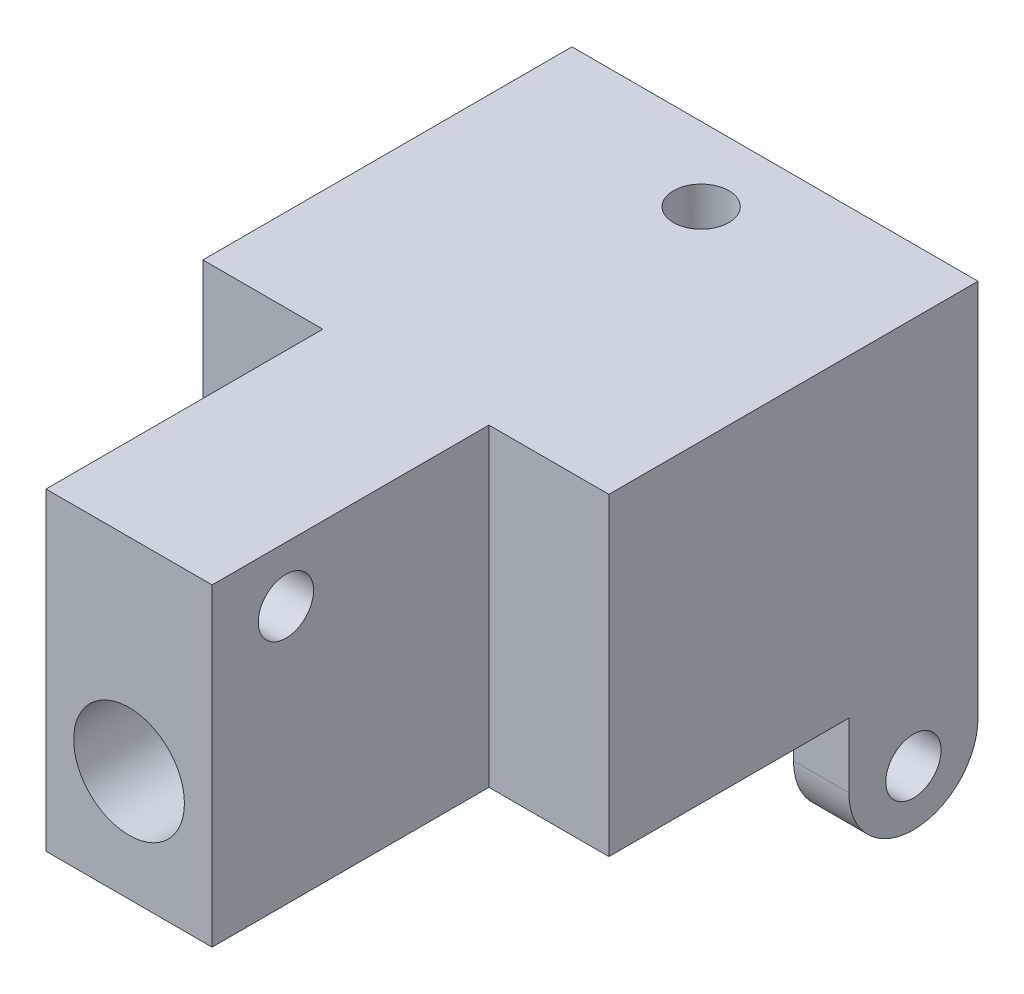
ISO-10303-21;
HEADER;
FILE_DESCRIPTION(('STEP AP214'),'2;1');
FILE_NAME('part.step','',(''),(''),'','','');
FILE_SCHEMA(('AUTOMOTIVE_DESIGN { 1 0 10303 214 1 1 1 1 }'));
ENDSEC;
DATA;
#1=APPLICATION_CONTEXT('core data for automotive mechanical design processes');
#2=APPLICATION_PROTOCOL_DEFINITION('international standard','automotive_design',2000,#1);
#3=PRODUCT_CONTEXT('',#1,'mechanical');
#4=PRODUCT('Part','Part','',(#3));
#5=PRODUCT_RELATED_PRODUCT_CATEGORY('part','',(#4));
#6=PRODUCT_DEFINITION_FORMATION('','',#4);
#7=PRODUCT_DEFINITION_CONTEXT('part definition',#1,'design');
#8=PRODUCT_DEFINITION('design','',#6,#7);
#9=PRODUCT_DEFINITION_SHAPE('','',#8);
#10=(LENGTH_UNIT() NAMED_UNIT(*) SI_UNIT(.MILLI.,.METRE.));
#11=(NAMED_UNIT(*) PLANE_ANGLE_UNIT() SI_UNIT($,.RADIAN.));
#12=(NAMED_UNIT(*) SI_UNIT($,.STERADIAN.) SOLID_ANGLE_UNIT());
#13=UNCERTAINTY_MEASURE_WITH_UNIT(LENGTH_MEASURE(1.E-05),#10,'distance_accuracy_value','');
#14=(GEOMETRIC_REPRESENTATION_CONTEXT(3) GLOBAL_UNCERTAINTY_ASSIGNED_CONTEXT((#13)) GLOBAL_UNIT_ASSIGNED_CONTEXT((#10,
#11,#12)) REPRESENTATION_CONTEXT('',''));
#15=CARTESIAN_POINT('',(0.,0.,0.));
#16=DIRECTION('',(0.,0.,1.));
#17=DIRECTION('',(1.,0.,0.));
#18=AXIS2_PLACEMENT_3D('',#15,#16,#17);
#19=CARTESIAN_POINT('',(0.,0.,20.));
#20=DIRECTION('',(0.,0.,-1.));
#21=DIRECTION('',(-1.,0.,0.));
#22=AXIS2_PLACEMENT_3D('',#19,#20,#21);
#23=PLANE('',#22);
#24=DIRECTION('',(0.,1.,0.));
#25=VECTOR('',#24,1.);
#26=CARTESIAN_POINT('',(4.5,0.,20.));
#27=LINE('',#26,#25);
#28=CARTESIAN_POINT('',(4.5,-6.,20.));
#29=VERTEX_POINT('',#28);
#30=CARTESIAN_POINT('',(4.5,11.,20.));
#31=VERTEX_POINT('',#30);
#32=EDGE_CURVE('E59',#29,#31,#27,.T.);
#33=ORIENTED_EDGE('',*,*,#32,.F.);
#34=DIRECTION('',(1.,0.,0.));
#35=VECTOR('',#34,1.);
#36=CARTESIAN_POINT('',(-11.,-6.,20.));
#37=LINE('',#36,#35);
#38=CARTESIAN_POINT('',(11.,-6.,20.));
#39=VERTEX_POINT('',#38);
#40=EDGE_CURVE('E191',#29,#39,#37,.T.);
#41=ORIENTED_EDGE('',*,*,#40,.T.);
#42=DIRECTION('',(0.,1.,0.));
#43=VECTOR('',#42,1.);
#44=CARTESIAN_POINT('',(11.,-6.,20.));
#45=LINE('',#44,#43);
#46=CARTESIAN_POINT('',(11.,11.,20.));
#47=VERTEX_POINT('',#46);
#48=EDGE_CURVE('E286',#39,#47,#45,.T.);
#49=ORIENTED_EDGE('',*,*,#48,.T.);
#50=DIRECTION('',(1.,0.,0.));
#51=VECTOR('',#50,1.);
#52=CARTESIAN_POINT('',(-11.,11.,20.));
#53=LINE('',#52,#51);
#54=EDGE_CURVE('E287',#31,#47,#53,.T.);
#55=ORIENTED_EDGE('',*,*,#54,.F.);
#56=EDGE_LOOP('',(#33,#41,#49,#55));
#57=FACE_BOUND('',#56,.T.);
#58=ADVANCED_FACE('F35',(#57),#23,.F.);
#59=CARTESIAN_POINT('',(0.,0.,7.));
#60=DIRECTION('',(0.,0.,-1.));
#61=DIRECTION('',(-1.,0.,0.));
#62=AXIS2_PLACEMENT_3D('',#59,#60,#61);
#63=PLANE('',#62);
#64=DIRECTION('',(1.,0.,0.));
#65=VECTOR('',#64,1.);
#66=CARTESIAN_POINT('',(0.,-6.,7.));
#67=LINE('',#66,#65);
#68=CARTESIAN_POINT('',(-11.,-6.,7.));
#69=VERTEX_POINT('',#68);
#70=CARTESIAN_POINT('',(-8.,-6.,7.));
#71=VERTEX_POINT('',#70);
#72=EDGE_CURVE('E11',#69,#71,#67,.T.);
#73=ORIENTED_EDGE('',*,*,#72,.F.);
#74=DIRECTION('',(0.,-1.,0.));
#75=VECTOR('',#74,1.);
#76=CARTESIAN_POINT('',(-11.,6.,7.));
#77=LINE('',#76,#75);
#78=CARTESIAN_POINT('',(-11.,-9.5,7.));
#79=VERTEX_POINT('',#78);
#80=EDGE_CURVE('E342',#69,#79,#77,.T.);
#81=ORIENTED_EDGE('',*,*,#80,.T.);
#82=DIRECTION('',(-1.,0.,0.));
#83=VECTOR('',#82,1.);
#84=CARTESIAN_POINT('',(15.9497474683058,-9.5,7.));
#85=LINE('',#84,#83);
#86=CARTESIAN_POINT('',(-8.,-9.5,7.));
#87=VERTEX_POINT('',#86);
#88=EDGE_CURVE('E359',#87,#79,#85,.T.);
#89=ORIENTED_EDGE('',*,*,#88,.F.);
#90=DIRECTION('',(0.,1.,0.));
#91=VECTOR('',#90,1.);
#92=CARTESIAN_POINT('',(-8.,-6.,7.));
#93=LINE('',#92,#91);
#94=EDGE_CURVE('E334',#87,#71,#93,.T.);
#95=ORIENTED_EDGE('',*,*,#94,.T.);
#96=EDGE_LOOP('',(#73,#81,#89,#95));
#97=FACE_BOUND('',#96,.T.);
#98=ADVANCED_FACE('F234',(#97),#63,.F.);
#99=CARTESIAN_POINT('',(8.,-6.,7.));
#100=VERTEX_POINT('',#99);
#101=CARTESIAN_POINT('',(11.,-6.,7.));
#102=VERTEX_POINT('',#101);
#103=EDGE_CURVE('E44',#100,#102,#67,.T.);
#104=ORIENTED_EDGE('',*,*,#103,.F.);
#105=DIRECTION('',(0.,-1.,0.));
#106=VECTOR('',#105,1.);
#107=CARTESIAN_POINT('',(8.,-6.,7.));
#108=LINE('',#107,#106);
#109=CARTESIAN_POINT('',(8.00000000000001,-9.5,7.));
#110=VERTEX_POINT('',#109);
#111=EDGE_CURVE('E336',#100,#110,#108,.T.);
#112=ORIENTED_EDGE('',*,*,#111,.T.);
#113=DIRECTION('',(-1.,0.,0.));
#114=VECTOR('',#113,1.);
#115=CARTESIAN_POINT('',(15.9497474683058,-9.5,7.));
#116=LINE('',#115,#114);
#117=CARTESIAN_POINT('',(11.,-9.5,7.));
#118=VERTEX_POINT('',#117);
#119=EDGE_CURVE('E326',#118,#110,#116,.T.);
#120=ORIENTED_EDGE('',*,*,#119,.F.);
#121=DIRECTION('',(0.,1.,0.));
#122=VECTOR('',#121,1.);
#123=CARTESIAN_POINT('',(11.,6.,7.));
#124=LINE('',#123,#122);
#125=EDGE_CURVE('E340',#118,#102,#124,.T.);
#126=ORIENTED_EDGE('',*,*,#125,.T.);
#127=EDGE_LOOP('',(#104,#112,#120,#126));
#128=FACE_BOUND('',#127,.T.);
#129=ADVANCED_FACE('F240',(#128),#63,.F.);
#130=CARTESIAN_POINT('',(-8.,-6.,7.));
#131=DIRECTION('',(-1.,0.,0.));
#132=DIRECTION('',(0.,0.,1.));
#133=AXIS2_PLACEMENT_3D('',#130,#131,#132);
#134=PLANE('',#133);
#135=CARTESIAN_POINT('',(-8.,-10.,3.5));
#136=DIRECTION('',(-1.,0.,0.));
#137=DIRECTION('',(0.,0.,1.));
#138=AXIS2_PLACEMENT_3D('',#135,#136,#137);
#139=CIRCLE('',#138,1.5);
#140=CARTESIAN_POINT('',(-8.,-10.,5.));
#141=VERTEX_POINT('',#140);
#142=EDGE_CURVE('E316',#141,#141,#139,.T.);
#143=ORIENTED_EDGE('',*,*,#142,.T.);
#144=EDGE_LOOP('',(#143));
#145=FACE_BOUND('',#144,.T.);
#146=CARTESIAN_POINT('',(-8.,-9.5,3.5));
#147=DIRECTION('',(-1.,0.,0.));
#148=DIRECTION('',(0.,0.,1.));
#149=AXIS2_PLACEMENT_3D('',#146,#147,#148);
#150=CIRCLE('',#149,3.5);
#151=CARTESIAN_POINT('',(-7.99999999999999,-9.5,0.));
#152=VERTEX_POINT('',#151);
#153=EDGE_CURVE('E331',#152,#87,#150,.T.);
#154=ORIENTED_EDGE('',*,*,#153,.F.);
#155=DIRECTION('',(0.,1.,0.));
#156=VECTOR('',#155,1.);
#157=CARTESIAN_POINT('',(-8.,-6.,0.));
#158=LINE('',#157,#156);
#159=CARTESIAN_POINT('',(-8.,-6.,0.));
#160=VERTEX_POINT('',#159);
#161=EDGE_CURVE('E333',#152,#160,#158,.T.);
#162=ORIENTED_EDGE('',*,*,#161,.T.);
#163=DIRECTION('',(0.,0.,-1.));
#164=VECTOR('',#163,1.);
#165=CARTESIAN_POINT('',(-8.,-6.,7.));
#166=LINE('',#165,#164);
#167=EDGE_CURVE('E356',#71,#160,#166,.T.);
#168=ORIENTED_EDGE('',*,*,#167,.F.);
#169=ORIENTED_EDGE('',*,*,#94,.F.);
#170=EDGE_LOOP('',(#154,#162,#168,#169));
#171=FACE_BOUND('',#170,.T.);
#172=ADVANCED_FACE('F37',(#145,#171),#134,.F.);
#173=CARTESIAN_POINT('',(8.,-6.,7.));
#174=DIRECTION('',(1.,0.,0.));
#175=DIRECTION('',(0.,0.,-1.));
#176=AXIS2_PLACEMENT_3D('',#173,#174,#175);
#177=PLANE('',#176);
#178=CARTESIAN_POINT('',(8.,-10.,3.5));
#179=DIRECTION('',(1.,0.,0.));
#180=DIRECTION('',(0.,0.,-1.));
#181=AXIS2_PLACEMENT_3D('',#178,#179,#180);
#182=CIRCLE('',#181,1.5);
#183=CARTESIAN_POINT('',(8.,-10.,2.));
#184=VERTEX_POINT('',#183);
#185=EDGE_CURVE('E313',#184,#184,#182,.T.);
#186=ORIENTED_EDGE('',*,*,#185,.T.);
#187=EDGE_LOOP('',(#186));
#188=FACE_BOUND('',#187,.T.);
#189=DIRECTION('',(0.,-1.,0.));
#190=VECTOR('',#189,1.);
#191=CARTESIAN_POINT('',(8.,-6.,0.));
#192=LINE('',#191,#190);
#193=CARTESIAN_POINT('',(8.,-6.,0.));
#194=VERTEX_POINT('',#193);
#195=CARTESIAN_POINT('',(8.00000000000001,-9.5,0.));
#196=VERTEX_POINT('',#195);
#197=EDGE_CURVE('E348',#194,#196,#192,.T.);
#198=ORIENTED_EDGE('',*,*,#197,.T.);
#199=CARTESIAN_POINT('',(8.,-9.5,3.5));
#200=DIRECTION('',(1.,0.,0.));
#201=DIRECTION('',(0.,0.,-1.));
#202=AXIS2_PLACEMENT_3D('',#199,#200,#201);
#203=CIRCLE('',#202,3.5);
#204=EDGE_CURVE('E325',#110,#196,#203,.T.);
#205=ORIENTED_EDGE('',*,*,#204,.F.);
#206=ORIENTED_EDGE('',*,*,#111,.F.);
#207=DIRECTION('',(0.,0.,-1.));
#208=VECTOR('',#207,1.);
#209=CARTESIAN_POINT('',(8.,-6.,7.));
#210=LINE('',#209,#208);
#211=EDGE_CURVE('E344',#100,#194,#210,.T.);
#212=ORIENTED_EDGE('',*,*,#211,.T.);
#213=EDGE_LOOP('',(#198,#205,#206,#212));
#214=FACE_BOUND('',#213,.T.);
#215=ADVANCED_FACE('F391',(#188,#214),#177,.F.);
#216=CARTESIAN_POINT('',(11.,6.,7.));
#217=DIRECTION('',(-1.,0.,0.));
#218=DIRECTION('',(0.,-1.,0.));
#219=AXIS2_PLACEMENT_3D('',#216,#217,#218);
#220=PLANE('',#219);
#221=DIRECTION('',(0.,0.,-1.));
#222=VECTOR('',#221,1.);
#223=CARTESIAN_POINT('',(11.,-6.,20.));
#224=LINE('',#223,#222);
#225=EDGE_CURVE('E301',#39,#102,#224,.T.);
#226=ORIENTED_EDGE('',*,*,#225,.T.);
#227=ORIENTED_EDGE('',*,*,#125,.F.);
#228=CARTESIAN_POINT('',(11.,-9.5,3.5));
#229=DIRECTION('',(-1.,0.,0.));
#230=DIRECTION('',(0.,-1.,0.));
#231=AXIS2_PLACEMENT_3D('',#228,#229,#230);
#232=CIRCLE('',#231,3.5);
#233=CARTESIAN_POINT('',(11.,-9.5,0.));
#234=VERTEX_POINT('',#233);
#235=EDGE_CURVE('E323',#118,#234,#232,.F.);
#236=ORIENTED_EDGE('',*,*,#235,.T.);
#237=DIRECTION('',(0.,1.,0.));
#238=VECTOR('',#237,1.);
#239=CARTESIAN_POINT('',(11.,6.,0.));
#240=LINE('',#239,#238);
#241=CARTESIAN_POINT('',(11.,11.,0.));
#242=VERTEX_POINT('',#241);
#243=EDGE_CURVE('E351',#234,#242,#240,.T.);
#244=ORIENTED_EDGE('',*,*,#243,.T.);
#245=DIRECTION('',(0.,0.,-1.));
#246=VECTOR('',#245,1.);
#247=CARTESIAN_POINT('',(11.,11.,20.));
#248=LINE('',#247,#246);
#249=EDGE_CURVE('E304',#47,#242,#248,.T.);
#250=ORIENTED_EDGE('',*,*,#249,.F.);
#251=ORIENTED_EDGE('',*,*,#48,.F.);
#252=EDGE_LOOP('',(#226,#227,#236,#244,#250,#251));
#253=FACE_BOUND('',#252,.T.);
#254=CARTESIAN_POINT('',(11.,-10.,3.5));
#255=DIRECTION('',(-1.,0.,0.));
#256=DIRECTION('',(0.,-1.,0.));
#257=AXIS2_PLACEMENT_3D('',#254,#255,#256);
#258=CIRCLE('',#257,1.5);
#259=CARTESIAN_POINT('',(11.,-11.5,3.5));
#260=VERTEX_POINT('',#259);
#261=EDGE_CURVE('E310',#260,#260,#258,.F.);
#262=ORIENTED_EDGE('',*,*,#261,.F.);
#263=EDGE_LOOP('',(#262));
#264=FACE_BOUND('',#263,.T.);
#265=ADVANCED_FACE('F371',(#253,#264),#220,.F.);
#266=CARTESIAN_POINT('',(-11.,6.,7.));
#267=DIRECTION('',(1.,0.,0.));
#268=DIRECTION('',(0.,1.,0.));
#269=AXIS2_PLACEMENT_3D('',#266,#267,#268);
#270=PLANE('',#269);
#271=DIRECTION('',(0.,-1.,0.));
#272=VECTOR('',#271,1.);
#273=CARTESIAN_POINT('',(-11.,6.,0.));
#274=LINE('',#273,#272);
#275=CARTESIAN_POINT('',(-11.,11.,0.));
#276=VERTEX_POINT('',#275);
#277=CARTESIAN_POINT('',(-11.,-9.5,0.));
#278=VERTEX_POINT('',#277);
#279=EDGE_CURVE('E337',#276,#278,#274,.T.);
#280=ORIENTED_EDGE('',*,*,#279,.T.);
#281=CARTESIAN_POINT('',(-11.,-9.5,3.5));
#282=DIRECTION('',(-1.,0.,0.));
#283=DIRECTION('',(0.,-1.,0.));
#284=AXIS2_PLACEMENT_3D('',#281,#282,#283);
#285=CIRCLE('',#284,3.5);
#286=EDGE_CURVE('E322',#278,#79,#285,.T.);
#287=ORIENTED_EDGE('',*,*,#286,.T.);
#288=ORIENTED_EDGE('',*,*,#80,.F.);
#289=DIRECTION('',(0.,0.,-1.));
#290=VECTOR('',#289,1.);
#291=CARTESIAN_POINT('',(-11.,-6.,20.));
#292=LINE('',#291,#290);
#293=CARTESIAN_POINT('',(-11.,-6.,20.));
#294=VERTEX_POINT('',#293);
#295=EDGE_CURVE('E298',#294,#69,#292,.T.);
#296=ORIENTED_EDGE('',*,*,#295,.F.);
#297=DIRECTION('',(0.,1.,0.));
#298=VECTOR('',#297,1.);
#299=CARTESIAN_POINT('',(-11.,-6.,20.));
#300=LINE('',#299,#298);
#301=CARTESIAN_POINT('',(-11.,11.,20.));
#302=VERTEX_POINT('',#301);
#303=EDGE_CURVE('E260',#294,#302,#300,.T.);
#304=ORIENTED_EDGE('',*,*,#303,.T.);
#305=DIRECTION('',(0.,0.,-1.));
#306=VECTOR('',#305,1.);
#307=CARTESIAN_POINT('',(-11.,11.,20.));
#308=LINE('',#307,#306);
#309=EDGE_CURVE('E262',#302,#276,#308,.T.);
#310=ORIENTED_EDGE('',*,*,#309,.T.);
#311=EDGE_LOOP('',(#280,#287,#288,#296,#304,#310));
#312=FACE_BOUND('',#311,.T.);
#313=CARTESIAN_POINT('',(-11.,-10.,3.5));
#314=DIRECTION('',(-1.,0.,0.));
#315=DIRECTION('',(0.,-1.,0.));
#316=AXIS2_PLACEMENT_3D('',#313,#314,#315);
#317=CIRCLE('',#316,1.5);
#318=CARTESIAN_POINT('',(-11.,-11.5,3.5));
#319=VERTEX_POINT('',#318);
#320=EDGE_CURVE('E300',#319,#319,#317,.T.);
#321=ORIENTED_EDGE('',*,*,#320,.F.);
#322=EDGE_LOOP('',(#321));
#323=FACE_BOUND('',#322,.T.);
#324=ADVANCED_FACE('F382',(#312,#323),#270,.F.);
#325=CARTESIAN_POINT('',(0.,0.,0.));
#326=DIRECTION('',(0.,0.,-1.));
#327=DIRECTION('',(-1.,0.,0.));
#328=AXIS2_PLACEMENT_3D('',#325,#326,#327);
#329=PLANE('',#328);
#330=DIRECTION('',(1.,0.,0.));
#331=VECTOR('',#330,1.);
#332=CARTESIAN_POINT('',(-2.65,6.5,0.));
#333=LINE('',#332,#331);
#334=CARTESIAN_POINT('',(-2.65,6.5,0.));
#335=VERTEX_POINT('',#334);
#336=CARTESIAN_POINT('',(2.65,6.5,0.));
#337=VERTEX_POINT('',#336);
#338=EDGE_CURVE('E678',#335,#337,#333,.T.);
#339=ORIENTED_EDGE('',*,*,#338,.F.);
#340=DIRECTION('',(0.,-1.,0.));
#341=VECTOR('',#340,1.);
#342=CARTESIAN_POINT('',(-2.65,6.5,0.));
#343=LINE('',#342,#341);
#344=CARTESIAN_POINT('',(-2.65,4.,0.));
#345=VERTEX_POINT('',#344);
#346=EDGE_CURVE('E675',#335,#345,#343,.T.);
#347=ORIENTED_EDGE('',*,*,#346,.T.);
#348=DIRECTION('',(1.,0.,0.));
#349=VECTOR('',#348,1.);
#350=CARTESIAN_POINT('',(-2.65,4.,0.));
#351=LINE('',#350,#349);
#352=CARTESIAN_POINT('',(2.65,4.,0.));
#353=VERTEX_POINT('',#352);
#354=EDGE_CURVE('E664',#345,#353,#351,.T.);
#355=ORIENTED_EDGE('',*,*,#354,.T.);
#356=DIRECTION('',(0.,-1.,0.));
#357=VECTOR('',#356,1.);
#358=CARTESIAN_POINT('',(2.65,6.5,0.));
#359=LINE('',#358,#357);
#360=EDGE_CURVE('E680',#337,#353,#359,.T.);
#361=ORIENTED_EDGE('',*,*,#360,.F.);
#362=EDGE_LOOP('',(#339,#347,#355,#361));
#363=FACE_BOUND('',#362,.T.);
#364=CARTESIAN_POINT('',(0.,0.,0.));
#365=DIRECTION('',(0.,0.,-1.));
#366=DIRECTION('',(-1.,0.,0.));
#367=AXIS2_PLACEMENT_3D('',#364,#365,#366);
#368=CIRCLE('',#367,3.);
#369=CARTESIAN_POINT('',(-3.,0.,0.));
#370=VERTEX_POINT('',#369);
#371=EDGE_CURVE('E297',#370,#370,#368,.F.);
#372=ORIENTED_EDGE('',*,*,#371,.T.);
#373=EDGE_LOOP('',(#372));
#374=FACE_BOUND('',#373,.T.);
#375=DIRECTION('',(1.,0.,0.));
#376=VECTOR('',#375,1.);
#377=CARTESIAN_POINT('',(8.,-6.,0.));
#378=LINE('',#377,#376);
#379=EDGE_CURVE('E346',#160,#194,#378,.T.);
#380=ORIENTED_EDGE('',*,*,#379,.F.);
#381=ORIENTED_EDGE('',*,*,#161,.F.);
#382=DIRECTION('',(-1.,0.,0.));
#383=VECTOR('',#382,1.);
#384=CARTESIAN_POINT('',(15.9497474683058,-9.5,0.));
#385=LINE('',#384,#383);
#386=EDGE_CURVE('E362',#152,#278,#385,.T.);
#387=ORIENTED_EDGE('',*,*,#386,.T.);
#388=ORIENTED_EDGE('',*,*,#279,.F.);
#389=DIRECTION('',(1.,0.,0.));
#390=VECTOR('',#389,1.);
#391=CARTESIAN_POINT('',(-11.,11.,0.));
#392=LINE('',#391,#390);
#393=EDGE_CURVE('E294',#276,#242,#392,.T.);
#394=ORIENTED_EDGE('',*,*,#393,.T.);
#395=ORIENTED_EDGE('',*,*,#243,.F.);
#396=DIRECTION('',(-1.,0.,0.));
#397=VECTOR('',#396,1.);
#398=CARTESIAN_POINT('',(15.9497474683058,-9.5,0.));
#399=LINE('',#398,#397);
#400=EDGE_CURVE('E319',#234,#196,#399,.T.);
#401=ORIENTED_EDGE('',*,*,#400,.T.);
#402=ORIENTED_EDGE('',*,*,#197,.F.);
#403=EDGE_LOOP('',(#380,#381,#387,#388,#394,#395,#401,#402));
#404=FACE_BOUND('',#403,.T.);
#405=ADVANCED_FACE('F377',(#363,#374,#404),#329,.T.);
#406=CARTESIAN_POINT('',(8.,-6.,7.));
#407=DIRECTION('',(0.,1.,0.));
#408=DIRECTION('',(-1.,0.,0.));
#409=AXIS2_PLACEMENT_3D('',#406,#407,#408);
#410=PLANE('',#409);
#411=ORIENTED_EDGE('',*,*,#379,.T.);
#412=ORIENTED_EDGE('',*,*,#211,.F.);
#413=ORIENTED_EDGE('',*,*,#103,.T.);
#414=ORIENTED_EDGE('',*,*,#225,.F.);
#415=ORIENTED_EDGE('',*,*,#40,.F.);
#416=DIRECTION('',(0.,0.,-1.));
#417=VECTOR('',#416,1.);
#418=CARTESIAN_POINT('',(4.5,-6.,35.));
#419=LINE('',#418,#417);
#420=CARTESIAN_POINT('',(4.5,-6.,35.));
#421=VERTEX_POINT('',#420);
#422=EDGE_CURVE('E172',#421,#29,#419,.T.);
#423=ORIENTED_EDGE('',*,*,#422,.F.);
#424=DIRECTION('',(1.,0.,0.));
#425=VECTOR('',#424,1.);
#426=CARTESIAN_POINT('',(0.,-6.,35.));
#427=LINE('',#426,#425);
#428=CARTESIAN_POINT('',(-4.5,-6.,35.));
#429=VERTEX_POINT('',#428);
#430=EDGE_CURVE('E178',#429,#421,#427,.T.);
#431=ORIENTED_EDGE('',*,*,#430,.F.);
#432=DIRECTION('',(0.,0.,-1.));
#433=VECTOR('',#432,1.);
#434=CARTESIAN_POINT('',(-4.5,-6.,35.));
#435=LINE('',#434,#433);
#436=CARTESIAN_POINT('',(-4.5,-6.,20.));
#437=VERTEX_POINT('',#436);
#438=EDGE_CURVE('E264',#429,#437,#435,.T.);
#439=ORIENTED_EDGE('',*,*,#438,.T.);
#440=EDGE_CURVE('E258',#294,#437,#37,.T.);
#441=ORIENTED_EDGE('',*,*,#440,.F.);
#442=ORIENTED_EDGE('',*,*,#295,.T.);
#443=ORIENTED_EDGE('',*,*,#72,.T.);
#444=ORIENTED_EDGE('',*,*,#167,.T.);
#445=EDGE_LOOP('',(#411,#412,#413,#414,#415,#423,#431,#439,#441,#442,#443,#444));
#446=FACE_BOUND('',#445,.T.);
#447=ADVANCED_FACE('F189',(#446),#410,.F.);
#448=CARTESIAN_POINT('',(15.9497474683058,-9.5,3.5));
#449=DIRECTION('',(-1.,0.,0.));
#450=DIRECTION('',(0.,-1.,0.));
#451=AXIS2_PLACEMENT_3D('',#448,#449,#450);
#452=CYLINDRICAL_SURFACE('',#451,3.5);
#453=ORIENTED_EDGE('',*,*,#153,.T.);
#454=ORIENTED_EDGE('',*,*,#88,.T.);
#455=ORIENTED_EDGE('',*,*,#286,.F.);
#456=ORIENTED_EDGE('',*,*,#386,.F.);
#457=EDGE_LOOP('',(#453,#454,#455,#456));
#458=FACE_BOUND('',#457,.T.);
#459=ADVANCED_FACE('F399',(#458),#452,.T.);
#460=ORIENTED_EDGE('',*,*,#204,.T.);
#461=ORIENTED_EDGE('',*,*,#400,.F.);
#462=ORIENTED_EDGE('',*,*,#235,.F.);
#463=ORIENTED_EDGE('',*,*,#119,.T.);
#464=EDGE_LOOP('',(#460,#461,#462,#463));
#465=FACE_BOUND('',#464,.T.);
#466=ADVANCED_FACE('F395',(#465),#452,.T.);
#467=CARTESIAN_POINT('',(15.2426406871193,-10.,3.5));
#468=DIRECTION('',(-1.,0.,0.));
#469=DIRECTION('',(0.,-1.,0.));
#470=AXIS2_PLACEMENT_3D('',#467,#468,#469);
#471=CYLINDRICAL_SURFACE('',#470,1.5);
#472=ORIENTED_EDGE('',*,*,#320,.T.);
#473=EDGE_LOOP('',(#472));
#474=FACE_BOUND('',#473,.T.);
#475=ORIENTED_EDGE('',*,*,#142,.F.);
#476=EDGE_LOOP('',(#475));
#477=FACE_BOUND('',#476,.T.);
#478=ADVANCED_FACE('F398',(#474,#477),#471,.F.);
#479=ORIENTED_EDGE('',*,*,#261,.T.);
#480=EDGE_LOOP('',(#479));
#481=FACE_BOUND('',#480,.T.);
#482=ORIENTED_EDGE('',*,*,#185,.F.);
#483=EDGE_LOOP('',(#482));
#484=FACE_BOUND('',#483,.T.);
#485=ADVANCED_FACE('F254',(#481,#484),#471,.F.);
#486=CARTESIAN_POINT('',(-11.,11.,20.));
#487=DIRECTION('',(0.,1.,0.));
#488=DIRECTION('',(-1.,0.,0.));
#489=AXIS2_PLACEMENT_3D('',#486,#487,#488);
#490=PLANE('',#489);
#491=CARTESIAN_POINT('',(0.,11.,4.));
#492=DIRECTION('',(0.,1.,0.));
#493=DIRECTION('',(-1.,0.,0.));
#494=AXIS2_PLACEMENT_3D('',#491,#492,#493);
#495=CIRCLE('',#494,1.5);
#496=CARTESIAN_POINT('',(-1.5,11.,4.));
#497=VERTEX_POINT('',#496);
#498=EDGE_CURVE('E192',#497,#497,#495,.T.);
#499=ORIENTED_EDGE('',*,*,#498,.F.);
#500=EDGE_LOOP('',(#499));
#501=FACE_BOUND('',#500,.T.);
#502=ORIENTED_EDGE('',*,*,#393,.F.);
#503=ORIENTED_EDGE('',*,*,#309,.F.);
#504=CARTESIAN_POINT('',(-4.5,11.,20.));
#505=VERTEX_POINT('',#504);
#506=EDGE_CURVE('E284',#302,#505,#53,.T.);
#507=ORIENTED_EDGE('',*,*,#506,.T.);
#508=DIRECTION('',(0.,0.,-1.));
#509=VECTOR('',#508,1.);
#510=CARTESIAN_POINT('',(-4.5,11.,35.));
#511=LINE('',#510,#509);
#512=CARTESIAN_POINT('',(-4.5,11.,35.));
#513=VERTEX_POINT('',#512);
#514=EDGE_CURVE('E197',#513,#505,#511,.T.);
#515=ORIENTED_EDGE('',*,*,#514,.F.);
#516=DIRECTION('',(-1.,0.,0.));
#517=VECTOR('',#516,1.);
#518=CARTESIAN_POINT('',(0.,11.,35.));
#519=LINE('',#518,#517);
#520=CARTESIAN_POINT('',(4.5,11.,35.));
#521=VERTEX_POINT('',#520);
#522=EDGE_CURVE('E177',#521,#513,#519,.T.);
#523=ORIENTED_EDGE('',*,*,#522,.F.);
#524=DIRECTION('',(0.,0.,-1.));
#525=VECTOR('',#524,1.);
#526=CARTESIAN_POINT('',(4.5,11.,35.));
#527=LINE('',#526,#525);
#528=EDGE_CURVE('E174',#521,#31,#527,.T.);
#529=ORIENTED_EDGE('',*,*,#528,.T.);
#530=ORIENTED_EDGE('',*,*,#54,.T.);
#531=ORIENTED_EDGE('',*,*,#249,.T.);
#532=EDGE_LOOP('',(#502,#503,#507,#515,#523,#529,#530,#531));
#533=FACE_BOUND('',#532,.T.);
#534=ADVANCED_FACE('F247',(#501,#533),#490,.T.);
#535=ORIENTED_EDGE('',*,*,#440,.T.);
#536=DIRECTION('',(0.,1.,0.));
#537=VECTOR('',#536,1.);
#538=CARTESIAN_POINT('',(-4.5,0.,20.));
#539=LINE('',#538,#537);
#540=EDGE_CURVE('E51',#437,#505,#539,.T.);
#541=ORIENTED_EDGE('',*,*,#540,.T.);
#542=ORIENTED_EDGE('',*,*,#506,.F.);
#543=ORIENTED_EDGE('',*,*,#303,.F.);
#544=EDGE_LOOP('',(#535,#541,#542,#543));
#545=FACE_BOUND('',#544,.T.);
#546=ADVANCED_FACE('F236',(#545),#23,.F.);
#547=CARTESIAN_POINT('',(0.,0.,-8.48528137423857));
#548=DIRECTION('',(0.,0.,1.));
#549=DIRECTION('',(1.,0.,0.));
#550=AXIS2_PLACEMENT_3D('',#547,#548,#549);
#551=CYLINDRICAL_SURFACE('',#550,3.);
#552=CARTESIAN_POINT('',(0.,3.,5.5));
#553=CARTESIAN_POINT('',(-0.0788579444268502,2.99999570107562,5.49999504652421));
#554=CARTESIAN_POINT('',(-0.157809899546344,2.99685736529635,5.49374489031842));
#555=CARTESIAN_POINT('',(-0.313380352903344,2.98461234055736,5.46902067948769));
#556=CARTESIAN_POINT('',(-0.389994130070444,2.97549431743379,5.45052341050328));
#557=CARTESIAN_POINT('',(-0.538400317320673,2.95224419105063,5.40220928707506));
#558=CARTESIAN_POINT('',(-0.61021020440872,2.93813158766306,5.37243642362805));
#559=CARTESIAN_POINT('',(-0.747708925209898,2.90618664773642,5.30264406795252));
#560=CARTESIAN_POINT('',(-0.813398240985089,2.88835460450288,5.2626253836267));
#561=CARTESIAN_POINT('',(-0.941261726642864,2.84934387387093,5.17072412577207));
#562=CARTESIAN_POINT('',(-1.00298281668316,2.82802798691306,5.11827028114054));
#563=CARTESIAN_POINT('',(-1.11716916730047,2.78489955370115,5.00421778112945));
#564=CARTESIAN_POINT('',(-1.16962737466015,2.76308664313552,4.94261222234134));
#565=CARTESIAN_POINT('',(-1.26787800067542,2.71948426796021,4.80627497571493));
#566=CARTESIAN_POINT('',(-1.31283800332745,2.69782780455198,4.73089585248113));
#567=CARTESIAN_POINT('',(-1.38925234033604,2.65928968158481,4.57244899602068));
#568=CARTESIAN_POINT('',(-1.4207163224495,2.64240461410484,4.48938680691588));
#569=CARTESIAN_POINT('',(-1.46719866328288,2.61686800556713,4.32300234186712));
#570=CARTESIAN_POINT('',(-1.48308878562066,2.6077840737557,4.23999332189891));
#571=CARTESIAN_POINT('',(-1.50064048996327,2.59772834922792,4.07203174333079));
#572=CARTESIAN_POINT('',(-1.50231613255961,2.59674854014932,3.98708118869327));
#573=CARTESIAN_POINT('',(-1.49203093075844,2.60266395385873,3.82857096352695));
#574=CARTESIAN_POINT('',(-1.48167683930523,2.6086314549302,3.75486395316542));
#575=CARTESIAN_POINT('',(-1.4504097735854,2.62614343100775,3.61041713594044));
#576=CARTESIAN_POINT('',(-1.42949343584648,2.63768968247664,3.53967828204203));
#577=CARTESIAN_POINT('',(-1.37731467057901,2.66531214619112,3.40115630115151));
#578=CARTESIAN_POINT('',(-1.34582260067399,2.68148760995998,3.33348040182132));
#579=CARTESIAN_POINT('',(-1.273562531502,2.71655106422106,3.20404856111499));
#580=CARTESIAN_POINT('',(-1.2327903657187,2.73544027170286,3.14229529659987));
#581=CARTESIAN_POINT('',(-1.13709908236918,2.77669736854929,3.01821812088516));
#582=CARTESIAN_POINT('',(-1.08104168755392,2.79920265355119,2.95681468963576));
#583=CARTESIAN_POINT('',(-0.95933336811206,2.84321434950611,2.84389687211365));
#584=CARTESIAN_POINT('',(-0.893677884861428,2.86472027938201,2.79238721194918));
#585=CARTESIAN_POINT('',(-0.750774758747772,2.90552980924446,2.69847150845541));
#586=CARTESIAN_POINT('',(-0.673130387399113,2.92468476243011,2.65659929133139));
#587=CARTESIAN_POINT('',(-0.510699323233195,2.95736821681863,2.58685445643549));
#588=CARTESIAN_POINT('',(-0.425918364397913,2.9709011841533,2.55897072247725));
#589=CARTESIAN_POINT('',(-0.259149737491053,2.98986500612153,2.52028689442499));
#590=CARTESIAN_POINT('',(-0.177512295822489,2.99587407451965,2.50826314637983));
#591=CARTESIAN_POINT('',(-0.0131693999240275,3.00109520188655,2.49780290329827));
#592=CARTESIAN_POINT('',(0.069535529804863,3.00031048081978,2.4993599715408));
#593=CARTESIAN_POINT('',(0.22684945797898,2.99236788380152,2.51531003262812));
#594=CARTESIAN_POINT('',(0.301589112074895,2.98570868532253,2.52869879909499));
#595=CARTESIAN_POINT('',(0.447610338452911,2.9673325697226,2.56635710784268));
#596=CARTESIAN_POINT('',(0.51889152853663,2.95561509501618,2.59062784968024));
#597=CARTESIAN_POINT('',(0.658332912674359,2.92776377120382,2.64999769964955));
#598=CARTESIAN_POINT('',(0.726345595508704,2.91151322654446,2.68538657517443));
#599=CARTESIAN_POINT('',(0.855692042548907,2.87615961476126,2.76566130346985));
#600=CARTESIAN_POINT('',(0.917022944664887,2.85705533350407,2.81055120189309));
#601=CARTESIAN_POINT('',(1.03765153393382,2.81562332004297,2.91364063799607));
#602=CARTESIAN_POINT('',(1.09615811672854,2.79316327265249,2.97271430266772));
#603=CARTESIAN_POINT('',(1.20278448167828,2.7489358741323,3.09988772691659));
#604=CARTESIAN_POINT('',(1.25089707856781,2.72716901100071,3.16799367827188));
#605=CARTESIAN_POINT('',(1.33756187171853,2.68576788309734,3.31546548125946));
#606=CARTESIAN_POINT('',(1.37553824370037,2.66628794383591,3.39521689914172));
#607=CARTESIAN_POINT('',(1.43712423890206,2.63361108441202,3.56126510136245));
#608=CARTESIAN_POINT('',(1.46075237380052,2.62040607332625,3.64755328970034));
#609=CARTESIAN_POINT('',(1.49079253120031,2.60342251538703,3.81536533432706));
#610=CARTESIAN_POINT('',(1.49863949460818,2.59886075197597,3.89655138015286));
#611=CARTESIAN_POINT('',(1.5010337315643,2.59748031962405,4.05917060074679));
#612=CARTESIAN_POINT('',(1.49558676993486,2.60065829439585,4.14060365310679));
#613=CARTESIAN_POINT('',(1.47288918838996,2.61356793076615,4.29322525230016));
#614=CARTESIAN_POINT('',(1.45681247151455,2.62264641723988,4.36465070521711));
#615=CARTESIAN_POINT('',(1.41476303733662,2.64556524281479,4.50371217913655));
#616=CARTESIAN_POINT('',(1.38878713673988,2.65940711354503,4.57134697313805));
#617=CARTESIAN_POINT('',(1.32572361795085,2.69142795546804,4.70593727647981));
#618=CARTESIAN_POINT('',(1.28800670672355,2.70983583593881,4.77254185274354));
#619=CARTESIAN_POINT('',(1.20322645745609,2.74852997452291,4.89891180427189));
#620=CARTESIAN_POINT('',(1.15615825686234,2.76881720693416,4.95867359578167));
#621=CARTESIAN_POINT('',(1.04730498999206,2.81193484737138,5.07721297353201));
#622=CARTESIAN_POINT('',(0.984426634495892,2.83477474959942,5.13498865352544));
#623=CARTESIAN_POINT('',(0.849232209349796,2.87816628389896,5.2393944751529));
#624=CARTESIAN_POINT('',(0.776911084957796,2.89871667939293,5.28601860920486));
#625=CARTESIAN_POINT('',(0.623897395174418,2.93547014349806,5.3668545440681));
#626=CARTESIAN_POINT('',(0.543149255665096,2.95164144740899,5.4009762538547));
#627=CARTESIAN_POINT('',(0.37611315170713,2.9775201194848,5.45471225163611));
#628=CARTESIAN_POINT('',(0.28984169938365,2.98724585044602,5.47436777020857));
#629=CARTESIAN_POINT('',(0.168902919736342,2.99543192870217,5.49084611662861));
#630=CARTESIAN_POINT('',(0.135242819162346,2.99714048010376,5.49427396129951));
#631=CARTESIAN_POINT('',(0.0677275977076366,2.99942545465223,5.49885199827113));
#632=CARTESIAN_POINT('',(0.0338724714699423,3.00000184655071,5.50000212770531));
#633=CARTESIAN_POINT('',(0.,3.,5.5));
#634=B_SPLINE_CURVE_WITH_KNOTS('',3,(#552,#553,#554,#555,#556,#557,#558,#559,#560,#561,#562,
#563,#564,#565,#566,#567,#568,#569,#570,#571,#572,#573,#574,#575,#576,#577,#578,#579,#580,#581,
#582,#583,#584,#585,#586,#587,#588,#589,#590,#591,#592,#593,#594,#595,#596,#597,#598,#599,#600,
#601,#602,#603,#604,#605,#606,#607,#608,#609,#610,#611,#612,#613,#614,#615,#616,#617,#618,#619,
#620,#621,#622,#623,#624,#625,#626,#627,#628,#629,#630,#631,#632,#633),.UNSPECIFIED.,.T.,.F.,(4,
2,2,2,2,2,2,2,2,2,2,2,2,2,2,2,2,2,2,2,2,2,2,2,2,2,2,2,2,2,2,2,2,2,2,2,2,2,2,2,4),(0.,
0.236436386130439,0.473322224563796,0.709293233238448,0.945245640872351,1.19547263807713,
1.44588935648105,1.71572589646129,1.98536921847421,2.23887018210344,2.49212035993531,
2.71508568613981,2.93812205888518,3.16635360252731,3.39468781890333,3.65197412000818,
3.9093830189803,4.17874533321661,4.44789325368419,4.69474935707018,4.94148846767214,
5.16910359759183,5.39674382446397,5.63089284041848,5.86514176122509,6.12239415966628,
6.37982382923148,6.64972023242589,6.91926767918176,7.1629396125457,7.40650589797017,
7.62686895373284,7.84730293182527,8.08254685170431,8.31791341715446,8.58187864135757,
8.84598575071869,9.1119602049529,9.37717362931724,9.47872920200875,9.58028757766599),.UNSPECIFIED.);
#635=CARTESIAN_POINT('',(0.,3.,5.5));
#636=VERTEX_POINT('',#635);
#637=EDGE_CURVE('E195',#636,#636,#634,.T.);
#638=ORIENTED_EDGE('',*,*,#637,.F.);
#639=EDGE_LOOP('',(#638));
#640=FACE_BOUND('',#639,.T.);
#641=ORIENTED_EDGE('',*,*,#371,.F.);
#642=EDGE_LOOP('',(#641));
#643=FACE_BOUND('',#642,.T.);
#644=CARTESIAN_POINT('',(0.,0.,35.));
#645=DIRECTION('',(0.,0.,1.));
#646=DIRECTION('',(1.,0.,0.));
#647=AXIS2_PLACEMENT_3D('',#644,#645,#646);
#648=CIRCLE('',#647,3.);
#649=CARTESIAN_POINT('',(3.,0.,35.));
#650=VERTEX_POINT('',#649);
#651=EDGE_CURVE('E187',#650,#650,#648,.F.);
#652=ORIENTED_EDGE('',*,*,#651,.F.);
#653=EDGE_LOOP('',(#652));
#654=FACE_BOUND('',#653,.T.);
#655=ADVANCED_FACE('F246',(#640,#643,#654),#551,.F.);
#656=CARTESIAN_POINT('',(-2.65,6.5,2.31684352126071));
#657=DIRECTION('',(-1.,0.,0.));
#658=DIRECTION('',(0.,0.,1.));
#659=AXIS2_PLACEMENT_3D('',#656,#657,#658);
#660=PLANE('',#659);
#661=DIRECTION('',(0.,0.,-1.));
#662=VECTOR('',#661,1.);
#663=CARTESIAN_POINT('',(-2.65,4.,2.31684352126071));
#664=LINE('',#663,#662);
#665=CARTESIAN_POINT('',(-2.65,4.,5.37679994796572));
#666=VERTEX_POINT('',#665);
#667=EDGE_CURVE('E667',#666,#345,#664,.T.);
#668=ORIENTED_EDGE('',*,*,#667,.T.);
#669=ORIENTED_EDGE('',*,*,#346,.F.);
#670=DIRECTION('',(0.,0.,-1.));
#671=VECTOR('',#670,1.);
#672=CARTESIAN_POINT('',(-2.65,6.5,5.37679994796572));
#673=LINE('',#672,#671);
#674=CARTESIAN_POINT('',(-2.65,6.5,5.37679994796572));
#675=VERTEX_POINT('',#674);
#676=EDGE_CURVE('E697',#675,#335,#673,.T.);
#677=ORIENTED_EDGE('',*,*,#676,.F.);
#678=DIRECTION('',(0.,-1.,0.));
#679=VECTOR('',#678,1.);
#680=CARTESIAN_POINT('',(-2.65,6.5,5.37679994796572));
#681=LINE('',#680,#679);
#682=EDGE_CURVE('E681',#675,#666,#681,.T.);
#683=ORIENTED_EDGE('',*,*,#682,.T.);
#684=EDGE_LOOP('',(#668,#669,#677,#683));
#685=FACE_BOUND('',#684,.T.);
#686=ADVANCED_FACE('F252',(#685),#660,.F.);
#687=CARTESIAN_POINT('',(0.,6.5,6.90677816131823));
#688=DIRECTION('',(-0.5,0.,0.866025403784439));
#689=DIRECTION('',(0.866025403784439,0.,0.5));
#690=AXIS2_PLACEMENT_3D('',#687,#688,#689);
#691=PLANE('',#690);
#692=DIRECTION('',(-0.866025403784439,0.,-0.5));
#693=VECTOR('',#692,1.);
#694=CARTESIAN_POINT('',(0.,4.,6.90677816131823));
#695=LINE('',#694,#693);
#696=CARTESIAN_POINT('',(0.,4.,6.90677816131823));
#697=VERTEX_POINT('',#696);
#698=EDGE_CURVE('E705',#697,#666,#695,.T.);
#699=ORIENTED_EDGE('',*,*,#698,.T.);
#700=ORIENTED_EDGE('',*,*,#682,.F.);
#701=DIRECTION('',(-0.866025403784439,0.,-0.5));
#702=VECTOR('',#701,1.);
#703=CARTESIAN_POINT('',(0.,6.5,6.90677816131823));
#704=LINE('',#703,#702);
#705=CARTESIAN_POINT('',(0.,6.5,6.90677816131823));
#706=VERTEX_POINT('',#705);
#707=EDGE_CURVE('E700',#706,#675,#704,.T.);
#708=ORIENTED_EDGE('',*,*,#707,.F.);
#709=DIRECTION('',(0.,-1.,0.));
#710=VECTOR('',#709,1.);
#711=CARTESIAN_POINT('',(0.,6.5,6.90677816131823));
#712=LINE('',#711,#710);
#713=EDGE_CURVE('E684',#706,#697,#712,.T.);
#714=ORIENTED_EDGE('',*,*,#713,.T.);
#715=EDGE_LOOP('',(#699,#700,#708,#714));
#716=FACE_BOUND('',#715,.T.);
#717=ADVANCED_FACE('F504',(#716),#691,.F.);
#718=CARTESIAN_POINT('',(2.65,6.5,5.37679994796572));
#719=DIRECTION('',(0.5,0.,0.866025403784439));
#720=DIRECTION('',(0.866025403784439,0.,-0.5));
#721=AXIS2_PLACEMENT_3D('',#718,#719,#720);
#722=PLANE('',#721);
#723=DIRECTION('',(-0.866025403784439,0.,0.5));
#724=VECTOR('',#723,1.);
#725=CARTESIAN_POINT('',(2.65,4.,5.37679994796572));
#726=LINE('',#725,#724);
#727=CARTESIAN_POINT('',(2.65,4.,5.37679994796572));
#728=VERTEX_POINT('',#727);
#729=EDGE_CURVE('E655',#728,#697,#726,.T.);
#730=ORIENTED_EDGE('',*,*,#729,.T.);
#731=ORIENTED_EDGE('',*,*,#713,.F.);
#732=DIRECTION('',(-0.866025403784439,0.,0.5));
#733=VECTOR('',#732,1.);
#734=CARTESIAN_POINT('',(2.65,6.5,5.37679994796572));
#735=LINE('',#734,#733);
#736=CARTESIAN_POINT('',(2.65,6.5,5.37679994796572));
#737=VERTEX_POINT('',#736);
#738=EDGE_CURVE('E711',#737,#706,#735,.T.);
#739=ORIENTED_EDGE('',*,*,#738,.F.);
#740=DIRECTION('',(0.,-1.,0.));
#741=VECTOR('',#740,1.);
#742=CARTESIAN_POINT('',(2.65,6.5,5.37679994796572));
#743=LINE('',#742,#741);
#744=EDGE_CURVE('E688',#737,#728,#743,.T.);
#745=ORIENTED_EDGE('',*,*,#744,.T.);
#746=EDGE_LOOP('',(#730,#731,#739,#745));
#747=FACE_BOUND('',#746,.T.);
#748=ADVANCED_FACE('F515',(#747),#722,.F.);
#749=CARTESIAN_POINT('',(2.65,6.5,2.3168435212607));
#750=DIRECTION('',(1.,0.,0.));
#751=DIRECTION('',(0.,0.,-1.));
#752=AXIS2_PLACEMENT_3D('',#749,#750,#751);
#753=PLANE('',#752);
#754=DIRECTION('',(0.,0.,1.));
#755=VECTOR('',#754,1.);
#756=CARTESIAN_POINT('',(2.65,4.,2.3168435212607));
#757=LINE('',#756,#755);
#758=EDGE_CURVE('E653',#353,#728,#757,.T.);
#759=ORIENTED_EDGE('',*,*,#758,.T.);
#760=ORIENTED_EDGE('',*,*,#744,.F.);
#761=DIRECTION('',(0.,0.,1.));
#762=VECTOR('',#761,1.);
#763=CARTESIAN_POINT('',(2.65,6.5,0.));
#764=LINE('',#763,#762);
#765=EDGE_CURVE('E671',#337,#737,#764,.T.);
#766=ORIENTED_EDGE('',*,*,#765,.F.);
#767=ORIENTED_EDGE('',*,*,#360,.T.);
#768=EDGE_LOOP('',(#759,#760,#766,#767));
#769=FACE_BOUND('',#768,.T.);
#770=ADVANCED_FACE('F525',(#769),#753,.F.);
#771=CARTESIAN_POINT('',(0.,6.5,0.));
#772=DIRECTION('',(0.,1.,0.));
#773=DIRECTION('',(0.,0.,1.));
#774=AXIS2_PLACEMENT_3D('',#771,#772,#773);
#775=PLANE('',#774);
#776=CARTESIAN_POINT('',(0.,6.5,4.));
#777=DIRECTION('',(0.,1.,0.));
#778=DIRECTION('',(0.,0.,1.));
#779=AXIS2_PLACEMENT_3D('',#776,#777,#778);
#780=CIRCLE('',#779,1.5);
#781=CARTESIAN_POINT('',(0.,6.5,5.5));
#782=VERTEX_POINT('',#781);
#783=EDGE_CURVE('E208',#782,#782,#780,.T.);
#784=ORIENTED_EDGE('',*,*,#783,.T.);
#785=EDGE_LOOP('',(#784));
#786=FACE_BOUND('',#785,.T.);
#787=ORIENTED_EDGE('',*,*,#765,.T.);
#788=ORIENTED_EDGE('',*,*,#738,.T.);
#789=ORIENTED_EDGE('',*,*,#707,.T.);
#790=ORIENTED_EDGE('',*,*,#676,.T.);
#791=ORIENTED_EDGE('',*,*,#338,.T.);
#792=EDGE_LOOP('',(#787,#788,#789,#790,#791));
#793=FACE_BOUND('',#792,.T.);
#794=ADVANCED_FACE('F536',(#786,#793),#775,.F.);
#795=CARTESIAN_POINT('',(0.,4.,0.));
#796=DIRECTION('',(0.,1.,0.));
#797=DIRECTION('',(0.,0.,1.));
#798=AXIS2_PLACEMENT_3D('',#795,#796,#797);
#799=PLANE('',#798);
#800=CARTESIAN_POINT('',(0.,4.,4.));
#801=DIRECTION('',(0.,1.,0.));
#802=DIRECTION('',(0.,0.,1.));
#803=AXIS2_PLACEMENT_3D('',#800,#801,#802);
#804=CIRCLE('',#803,1.5);
#805=CARTESIAN_POINT('',(0.,4.,5.5));
#806=VERTEX_POINT('',#805);
#807=EDGE_CURVE('E39',#806,#806,#804,.T.);
#808=ORIENTED_EDGE('',*,*,#807,.F.);
#809=EDGE_LOOP('',(#808));
#810=FACE_BOUND('',#809,.T.);
#811=ORIENTED_EDGE('',*,*,#354,.F.);
#812=ORIENTED_EDGE('',*,*,#667,.F.);
#813=ORIENTED_EDGE('',*,*,#698,.F.);
#814=ORIENTED_EDGE('',*,*,#729,.F.);
#815=ORIENTED_EDGE('',*,*,#758,.F.);
#816=EDGE_LOOP('',(#811,#812,#813,#814,#815));
#817=FACE_BOUND('',#816,.T.);
#818=ADVANCED_FACE('F546',(#810,#817),#799,.T.);
#819=CARTESIAN_POINT('',(0.,-13.001,4.));
#820=DIRECTION('',(0.,1.,0.));
#821=DIRECTION('',(0.,0.,1.));
#822=AXIS2_PLACEMENT_3D('',#819,#820,#821);
#823=CYLINDRICAL_SURFACE('',#822,1.5);
#824=ORIENTED_EDGE('',*,*,#807,.T.);
#825=EDGE_LOOP('',(#824));
#826=FACE_BOUND('',#825,.T.);
#827=ORIENTED_EDGE('',*,*,#637,.T.);
#828=EDGE_LOOP('',(#827));
#829=FACE_BOUND('',#828,.T.);
#830=ADVANCED_FACE('F210',(#826,#829),#823,.F.);
#831=ORIENTED_EDGE('',*,*,#498,.T.);
#832=EDGE_LOOP('',(#831));
#833=FACE_BOUND('',#832,.T.);
#834=ORIENTED_EDGE('',*,*,#783,.F.);
#835=EDGE_LOOP('',(#834));
#836=FACE_BOUND('',#835,.T.);
#837=ADVANCED_FACE('F218',(#833,#836),#823,.F.);
#838=CARTESIAN_POINT('',(4.5,0.,35.));
#839=DIRECTION('',(-1.,0.,0.));
#840=DIRECTION('',(0.,-1.,0.));
#841=AXIS2_PLACEMENT_3D('',#838,#839,#840);
#842=PLANE('',#841);
#843=CARTESIAN_POINT('',(4.5,8.,31.));
#844=DIRECTION('',(1.,0.,0.));
#845=DIRECTION('',(0.,1.,0.));
#846=AXIS2_PLACEMENT_3D('',#843,#844,#845);
#847=CIRCLE('',#846,1.5);
#848=CARTESIAN_POINT('',(4.5,9.5,31.));
#849=VERTEX_POINT('',#848);
#850=EDGE_CURVE('E279',#849,#849,#847,.T.);
#851=ORIENTED_EDGE('',*,*,#850,.F.);
#852=EDGE_LOOP('',(#851));
#853=FACE_BOUND('',#852,.T.);
#854=ORIENTED_EDGE('',*,*,#32,.T.);
#855=ORIENTED_EDGE('',*,*,#528,.F.);
#856=DIRECTION('',(0.,1.,0.));
#857=VECTOR('',#856,1.);
#858=CARTESIAN_POINT('',(4.5,0.,35.));
#859=LINE('',#858,#857);
#860=EDGE_CURVE('E168',#421,#521,#859,.T.);
#861=ORIENTED_EDGE('',*,*,#860,.F.);
#862=ORIENTED_EDGE('',*,*,#422,.T.);
#863=EDGE_LOOP('',(#854,#855,#861,#862));
#864=FACE_BOUND('',#863,.T.);
#865=ADVANCED_FACE('F170',(#853,#864),#842,.F.);
#866=CARTESIAN_POINT('',(-4.5,0.,35.));
#867=DIRECTION('',(-1.,0.,0.));
#868=DIRECTION('',(0.,0.,1.));
#869=AXIS2_PLACEMENT_3D('',#866,#867,#868);
#870=PLANE('',#869);
#871=CARTESIAN_POINT('',(-4.5,8.,31.));
#872=DIRECTION('',(-1.,0.,0.));
#873=DIRECTION('',(0.,0.,1.));
#874=AXIS2_PLACEMENT_3D('',#871,#872,#873);
#875=CIRCLE('',#874,1.5);
#876=CARTESIAN_POINT('',(-4.5,9.5,31.));
#877=VERTEX_POINT('',#876);
#878=EDGE_CURVE('E272',#877,#877,#875,.F.);
#879=ORIENTED_EDGE('',*,*,#878,.T.);
#880=EDGE_LOOP('',(#879));
#881=FACE_BOUND('',#880,.T.);
#882=ORIENTED_EDGE('',*,*,#540,.F.);
#883=ORIENTED_EDGE('',*,*,#438,.F.);
#884=DIRECTION('',(0.,1.,0.));
#885=VECTOR('',#884,1.);
#886=CARTESIAN_POINT('',(-4.5,0.,35.));
#887=LINE('',#886,#885);
#888=EDGE_CURVE('E184',#429,#513,#887,.T.);
#889=ORIENTED_EDGE('',*,*,#888,.T.);
#890=ORIENTED_EDGE('',*,*,#514,.T.);
#891=EDGE_LOOP('',(#882,#883,#889,#890));
#892=FACE_BOUND('',#891,.T.);
#893=ADVANCED_FACE('F217',(#881,#892),#870,.T.);
#894=CARTESIAN_POINT('',(0.,0.,35.));
#895=DIRECTION('',(0.,0.,1.));
#896=DIRECTION('',(1.,0.,0.));
#897=AXIS2_PLACEMENT_3D('',#894,#895,#896);
#898=PLANE('',#897);
#899=ORIENTED_EDGE('',*,*,#651,.T.);
#900=EDGE_LOOP('',(#899));
#901=FACE_BOUND('',#900,.T.);
#902=ORIENTED_EDGE('',*,*,#430,.T.);
#903=ORIENTED_EDGE('',*,*,#860,.T.);
#904=ORIENTED_EDGE('',*,*,#522,.T.);
#905=ORIENTED_EDGE('',*,*,#888,.F.);
#906=EDGE_LOOP('',(#902,#903,#904,#905));
#907=FACE_BOUND('',#906,.T.);
#908=ADVANCED_FACE('F182',(#901,#907),#898,.T.);
#909=CARTESIAN_POINT('',(-8.74264068711929,8.,31.));
#910=DIRECTION('',(1.,0.,0.));
#911=DIRECTION('',(0.,1.,0.));
#912=AXIS2_PLACEMENT_3D('',#909,#910,#911);
#913=CYLINDRICAL_SURFACE('',#912,1.5);
#914=CARTESIAN_POINT('',(4.5,9.5,31.));
#915=CARTESIAN_POINT('',(4.40625,9.5,31.));
#916=CARTESIAN_POINT('',(4.3125,9.5,31.));
#917=CARTESIAN_POINT('',(4.125,9.5,31.));
#918=CARTESIAN_POINT('',(4.03125,9.5,31.));
#919=CARTESIAN_POINT('',(3.84375,9.5,31.));
#920=CARTESIAN_POINT('',(3.75,9.5,31.));
#921=CARTESIAN_POINT('',(3.5625,9.5,31.));
#922=CARTESIAN_POINT('',(3.46875,9.5,31.));
#923=CARTESIAN_POINT('',(3.28125,9.5,31.));
#924=CARTESIAN_POINT('',(3.1875,9.5,31.));
#925=CARTESIAN_POINT('',(3.,9.5,31.));
#926=CARTESIAN_POINT('',(2.90625,9.5,31.));
#927=CARTESIAN_POINT('',(2.71875,9.5,31.));
#928=CARTESIAN_POINT('',(2.625,9.5,31.));
#929=CARTESIAN_POINT('',(2.4375,9.5,31.));
#930=CARTESIAN_POINT('',(2.34375,9.5,31.));
#931=CARTESIAN_POINT('',(2.15625,9.5,31.));
#932=CARTESIAN_POINT('',(2.0625,9.5,31.));
#933=CARTESIAN_POINT('',(1.875,9.5,31.));
#934=CARTESIAN_POINT('',(1.78125,9.5,31.));
#935=CARTESIAN_POINT('',(1.59375,9.5,31.));
#936=CARTESIAN_POINT('',(1.5,9.5,31.));
#937=CARTESIAN_POINT('',(1.3125,9.5,31.));
#938=CARTESIAN_POINT('',(1.21875,9.5,31.));
#939=CARTESIAN_POINT('',(1.03125,9.5,31.));
#940=CARTESIAN_POINT('',(0.937499999999999,9.5,31.));
#941=CARTESIAN_POINT('',(0.749999999999999,9.5,31.));
#942=CARTESIAN_POINT('',(0.656249999999999,9.5,31.));
#943=CARTESIAN_POINT('',(0.468749999999999,9.5,31.));
#944=CARTESIAN_POINT('',(0.374999999999999,9.5,31.));
#945=CARTESIAN_POINT('',(0.187499999999998,9.5,31.));
#946=CARTESIAN_POINT('',(0.0937499999999983,9.5,31.));
#947=CARTESIAN_POINT('',(-0.0937500000000018,9.5,31.));
#948=CARTESIAN_POINT('',(-0.187500000000002,9.5,31.));
#949=CARTESIAN_POINT('',(-0.375000000000001,9.5,31.));
#950=CARTESIAN_POINT('',(-0.468750000000001,9.5,31.));
#951=CARTESIAN_POINT('',(-0.656250000000001,9.5,31.));
#952=CARTESIAN_POINT('',(-0.750000000000001,9.5,31.));
#953=CARTESIAN_POINT('',(-0.937500000000001,9.5,31.));
#954=CARTESIAN_POINT('',(-1.03125,9.5,31.));
#955=CARTESIAN_POINT('',(-1.21875,9.5,31.));
#956=CARTESIAN_POINT('',(-1.3125,9.5,31.));
#957=CARTESIAN_POINT('',(-1.5,9.5,31.));
#958=CARTESIAN_POINT('',(-1.59375,9.5,31.));
#959=CARTESIAN_POINT('',(-1.78125,9.5,31.));
#960=CARTESIAN_POINT('',(-1.875,9.5,31.));
#961=CARTESIAN_POINT('',(-2.0625,9.5,31.));
#962=CARTESIAN_POINT('',(-2.15625,9.5,31.));
#963=CARTESIAN_POINT('',(-2.34375,9.5,31.));
#964=CARTESIAN_POINT('',(-2.4375,9.5,31.));
#965=CARTESIAN_POINT('',(-2.625,9.5,31.));
#966=CARTESIAN_POINT('',(-2.71875,9.5,31.));
#967=CARTESIAN_POINT('',(-2.90625,9.5,31.));
#968=CARTESIAN_POINT('',(-3.,9.5,31.));
#969=CARTESIAN_POINT('',(-3.1875,9.5,31.));
#970=CARTESIAN_POINT('',(-3.28125,9.5,31.));
#971=CARTESIAN_POINT('',(-3.46875,9.5,31.));
#972=CARTESIAN_POINT('',(-3.5625,9.5,31.));
#973=CARTESIAN_POINT('',(-3.75,9.5,31.));
#974=CARTESIAN_POINT('',(-3.84375,9.5,31.));
#975=CARTESIAN_POINT('',(-4.03125,9.5,31.));
#976=CARTESIAN_POINT('',(-4.125,9.5,31.));
#977=CARTESIAN_POINT('',(-4.3125,9.5,31.));
#978=CARTESIAN_POINT('',(-4.40625,9.5,31.));
#979=CARTESIAN_POINT('',(-4.5,9.5,31.));
#980=B_SPLINE_CURVE_WITH_KNOTS('',3,(#914,#915,#916,#917,#918,#919,#920,#921,#922,#923,#924,
#925,#926,#927,#928,#929,#930,#931,#932,#933,#934,#935,#936,#937,#938,#939,#940,#941,#942,#943,
#944,#945,#946,#947,#948,#949,#950,#951,#952,#953,#954,#955,#956,#957,#958,#959,#960,#961,#962,
#963,#964,#965,#966,#967,#968,#969,#970,#971,#972,#973,#974,#975,#976,#977,#978,#979),
.UNSPECIFIED.,.F.,.F.,(4,2,2,2,2,2,2,2,2,2,2,2,2,2,2,2,2,2,2,2,2,2,2,2,2,2,2,2,2,2,2,2,4),(0.,
0.28125,0.5625,0.843750000000001,1.125,1.40625,1.6875,1.96875,2.25,2.53125,2.8125,3.09375,3.375,
3.65625,3.9375,4.21875,4.5,4.78125,5.0625,5.34375,5.625,5.90625,6.1875,6.46875,6.75,7.03125,
7.3125,7.59375,7.875,8.15625,8.4375,8.71875,9.),.UNSPECIFIED.);
#981=EDGE_CURVE('BSEAM225',#849,#877,#980,.T.);
#982=ORIENTED_EDGE('',*,*,#850,.T.);
#983=ORIENTED_EDGE('',*,*,#878,.F.);
#984=ORIENTED_EDGE('',*,*,#981,.T.);
#985=ORIENTED_EDGE('',*,*,#981,.F.);
#986=EDGE_LOOP('',(#982,#984,#983,#985));
#987=FACE_BOUND('',#986,.T.);
#988=ADVANCED_FACE('F225',(#987),#913,.F.);
#989=CLOSED_SHELL('',(#58,#98,#129,#172,#215,#265,#324,#405,#447,#459,#466,#478,#485,#534,#546,
#655,#686,#717,#748,#770,#794,#818,#830,#837,#865,#893,#908,#988));
#990=MANIFOLD_SOLID_BREP('B2',#989);
#991=ADVANCED_BREP_SHAPE_REPRESENTATION('',(#18,#990),#14);
#992=SHAPE_DEFINITION_REPRESENTATION(#9,#991);
ENDSEC;
END-ISO-10303-21;
